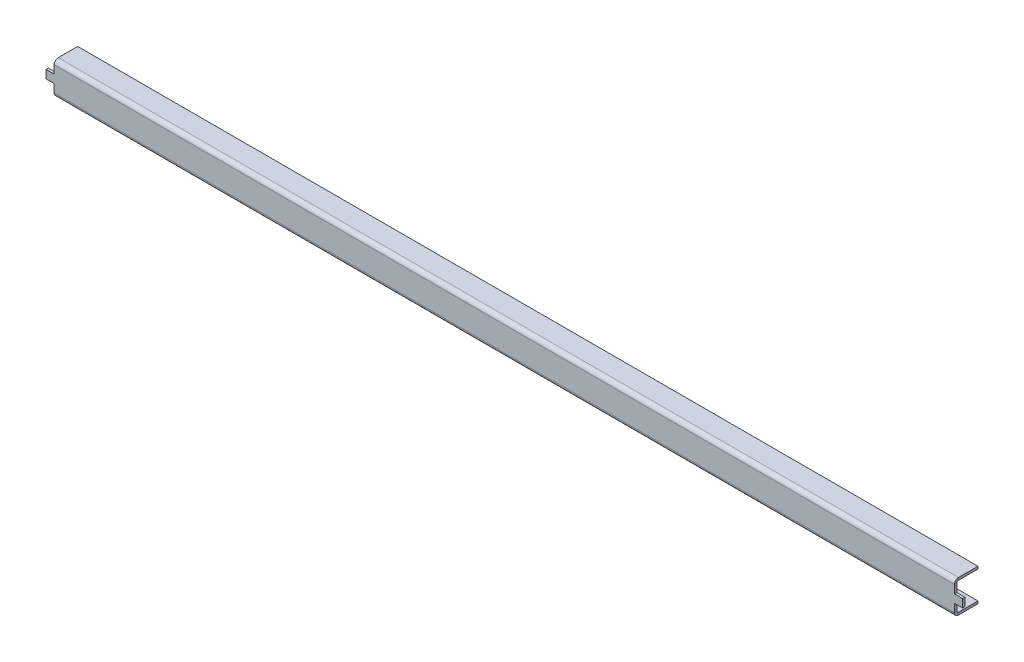
ISO-10303-21;
HEADER;
FILE_DESCRIPTION(('STEP AP214'),'2;1');
FILE_NAME('part.step','',(''),(''),'','','');
FILE_SCHEMA(('AUTOMOTIVE_DESIGN { 1 0 10303 214 1 1 1 1 }'));
ENDSEC;
DATA;
#1=APPLICATION_CONTEXT('core data for automotive mechanical design processes');
#2=APPLICATION_PROTOCOL_DEFINITION('international standard','automotive_design',2000,#1);
#3=PRODUCT_CONTEXT('',#1,'mechanical');
#4=PRODUCT('Part','Part','',(#3));
#5=PRODUCT_RELATED_PRODUCT_CATEGORY('part','',(#4));
#6=PRODUCT_DEFINITION_FORMATION('','',#4);
#7=PRODUCT_DEFINITION_CONTEXT('part definition',#1,'design');
#8=PRODUCT_DEFINITION('design','',#6,#7);
#9=PRODUCT_DEFINITION_SHAPE('','',#8);
#10=(LENGTH_UNIT() NAMED_UNIT(*) SI_UNIT(.MILLI.,.METRE.));
#11=(NAMED_UNIT(*) PLANE_ANGLE_UNIT() SI_UNIT($,.RADIAN.));
#12=(NAMED_UNIT(*) SI_UNIT($,.STERADIAN.) SOLID_ANGLE_UNIT());
#13=UNCERTAINTY_MEASURE_WITH_UNIT(LENGTH_MEASURE(1.E-05),#10,'distance_accuracy_value','');
#14=(GEOMETRIC_REPRESENTATION_CONTEXT(3) GLOBAL_UNCERTAINTY_ASSIGNED_CONTEXT((#13)) GLOBAL_UNIT_ASSIGNED_CONTEXT((#10,
#11,#12)) REPRESENTATION_CONTEXT('',''));
#15=CARTESIAN_POINT('',(0.,0.,0.));
#16=DIRECTION('',(0.,0.,1.));
#17=DIRECTION('',(1.,0.,0.));
#18=AXIS2_PLACEMENT_3D('',#15,#16,#17);
#19=CARTESIAN_POINT('',(277.5,-765.75989731651,4.21884749357559E-12));
#20=DIRECTION('',(0.,0.,1.));
#21=DIRECTION('',(0.,-1.,0.));
#22=AXIS2_PLACEMENT_3D('',#19,#20,#21);
#23=PLANE('',#22);
#24=DIRECTION('',(0.,1.,0.));
#25=VECTOR('',#24,1.);
#26=CARTESIAN_POINT('',(-277.5,-765.75989731651,4.21884749357559E-12));
#27=LINE('',#26,#25);
#28=CARTESIAN_POINT('',(-277.5,342.5,0.));
#29=VERTEX_POINT('',#28);
#30=CARTESIAN_POINT('',(-277.5,344.,0.));
#31=VERTEX_POINT('',#30);
#32=EDGE_CURVE('E292',#29,#31,#27,.T.);
#33=ORIENTED_EDGE('',*,*,#32,.T.);
#34=DIRECTION('',(1.,0.,0.));
#35=VECTOR('',#34,1.);
#36=CARTESIAN_POINT('',(277.5,344.,0.));
#37=LINE('',#36,#35);
#38=CARTESIAN_POINT('',(276.5,344.,0.));
#39=VERTEX_POINT('',#38);
#40=EDGE_CURVE('E280',#31,#39,#37,.T.);
#41=ORIENTED_EDGE('',*,*,#40,.T.);
#42=DIRECTION('',(0.,1.,0.));
#43=VECTOR('',#42,1.);
#44=CARTESIAN_POINT('',(276.5,-765.75989731651,4.16333634234434E-12));
#45=LINE('',#44,#43);
#46=CARTESIAN_POINT('',(276.5,342.5,-1.11022302462516E-13));
#47=VERTEX_POINT('',#46);
#48=EDGE_CURVE('E338',#47,#39,#45,.T.);
#49=ORIENTED_EDGE('',*,*,#48,.F.);
#50=DIRECTION('',(1.,0.,0.));
#51=VECTOR('',#50,1.);
#52=CARTESIAN_POINT('',(277.5,342.5,0.));
#53=LINE('',#52,#51);
#54=EDGE_CURVE('E65',#29,#47,#53,.T.);
#55=ORIENTED_EDGE('',*,*,#54,.F.);
#56=EDGE_LOOP('',(#33,#41,#49,#55));
#57=FACE_BOUND('',#56,.T.);
#58=ADVANCED_FACE('F53',(#57),#23,.F.);
#59=CARTESIAN_POINT('',(-277.5,-765.759897316509,12.0000000000043));
#60=DIRECTION('',(-1.,0.,0.));
#61=DIRECTION('',(0.,0.,1.));
#62=AXIS2_PLACEMENT_3D('',#59,#60,#61);
#63=PLANE('',#62);
#64=DIRECTION('',(0.,0.,1.));
#65=VECTOR('',#64,1.);
#66=CARTESIAN_POINT('',(-277.5,344.,12.0000000000001));
#67=LINE('',#66,#65);
#68=CARTESIAN_POINT('',(-277.5,344.,12.));
#69=VERTEX_POINT('',#68);
#70=EDGE_CURVE('E266',#69,#31,#67,.F.);
#71=ORIENTED_EDGE('',*,*,#70,.T.);
#72=ORIENTED_EDGE('',*,*,#32,.F.);
#73=DIRECTION('',(0.,0.,1.));
#74=VECTOR('',#73,1.);
#75=CARTESIAN_POINT('',(-277.5,342.5,12.0000000000001));
#76=LINE('',#75,#74);
#77=CARTESIAN_POINT('',(-277.5,342.5,12.0000000000001));
#78=VERTEX_POINT('',#77);
#79=EDGE_CURVE('E110',#29,#78,#76,.T.);
#80=ORIENTED_EDGE('',*,*,#79,.T.);
#81=DIRECTION('',(0.,1.,0.));
#82=VECTOR('',#81,1.);
#83=CARTESIAN_POINT('',(-277.5,-765.759897316509,12.0000000000043));
#84=LINE('',#83,#82);
#85=EDGE_CURVE('E263',#78,#69,#84,.T.);
#86=ORIENTED_EDGE('',*,*,#85,.T.);
#87=EDGE_LOOP('',(#71,#72,#80,#86));
#88=FACE_BOUND('',#87,.T.);
#89=ADVANCED_FACE('F265',(#88),#63,.T.);
#90=CARTESIAN_POINT('',(277.5,344.,0.));
#91=DIRECTION('',(0.,-1.,0.));
#92=DIRECTION('',(0.,0.,-1.));
#93=AXIS2_PLACEMENT_3D('',#90,#91,#92);
#94=PLANE('',#93);
#95=ORIENTED_EDGE('',*,*,#70,.F.);
#96=DIRECTION('',(-1.,0.,0.));
#97=VECTOR('',#96,1.);
#98=CARTESIAN_POINT('',(277.5,344.,12.));
#99=LINE('',#98,#97);
#100=CARTESIAN_POINT('',(276.5,344.,12.));
#101=VERTEX_POINT('',#100);
#102=EDGE_CURVE('E278',#101,#69,#99,.T.);
#103=ORIENTED_EDGE('',*,*,#102,.F.);
#104=DIRECTION('',(0.,0.,-1.));
#105=VECTOR('',#104,1.);
#106=CARTESIAN_POINT('',(276.5,344.,12.));
#107=LINE('',#106,#105);
#108=EDGE_CURVE('E272',#39,#101,#107,.F.);
#109=ORIENTED_EDGE('',*,*,#108,.F.);
#110=ORIENTED_EDGE('',*,*,#40,.F.);
#111=EDGE_LOOP('',(#95,#103,#109,#110));
#112=FACE_BOUND('',#111,.T.);
#113=ADVANCED_FACE('F277',(#112),#94,.F.);
#114=CARTESIAN_POINT('',(276.5,-765.75989731651,12.0000000000042));
#115=DIRECTION('',(1.,0.,0.));
#116=DIRECTION('',(0.,0.,-1.));
#117=AXIS2_PLACEMENT_3D('',#114,#115,#116);
#118=PLANE('',#117);
#119=ORIENTED_EDGE('',*,*,#108,.T.);
#120=DIRECTION('',(0.,1.,0.));
#121=VECTOR('',#120,1.);
#122=CARTESIAN_POINT('',(276.5,-765.75989731651,12.0000000000042));
#123=LINE('',#122,#121);
#124=CARTESIAN_POINT('',(276.5,342.5,12.));
#125=VERTEX_POINT('',#124);
#126=EDGE_CURVE('E58',#125,#101,#123,.T.);
#127=ORIENTED_EDGE('',*,*,#126,.F.);
#128=DIRECTION('',(0.,0.,-1.));
#129=VECTOR('',#128,1.);
#130=CARTESIAN_POINT('',(276.5,342.5,12.));
#131=LINE('',#130,#129);
#132=EDGE_CURVE('E77',#125,#47,#131,.T.);
#133=ORIENTED_EDGE('',*,*,#132,.T.);
#134=ORIENTED_EDGE('',*,*,#48,.T.);
#135=EDGE_LOOP('',(#119,#127,#133,#134));
#136=FACE_BOUND('',#135,.T.);
#137=ADVANCED_FACE('F493',(#136),#118,.T.);
#138=CARTESIAN_POINT('',(277.5,342.5,0.));
#139=DIRECTION('',(0.,-1.,0.));
#140=DIRECTION('',(0.,0.,-1.));
#141=AXIS2_PLACEMENT_3D('',#138,#139,#140);
#142=PLANE('',#141);
#143=ORIENTED_EDGE('',*,*,#79,.F.);
#144=ORIENTED_EDGE('',*,*,#54,.T.);
#145=ORIENTED_EDGE('',*,*,#132,.F.);
#146=DIRECTION('',(-1.,0.,0.));
#147=VECTOR('',#146,1.);
#148=CARTESIAN_POINT('',(277.5,342.5,12.));
#149=LINE('',#148,#147);
#150=EDGE_CURVE('E12',#125,#78,#149,.T.);
#151=ORIENTED_EDGE('',*,*,#150,.T.);
#152=EDGE_LOOP('',(#143,#144,#145,#151));
#153=FACE_BOUND('',#152,.T.);
#154=ADVANCED_FACE('F56',(#153),#142,.T.);
#155=CARTESIAN_POINT('',(277.5,1433.75989731651,4.21884749357559E-12));
#156=DIRECTION('',(0.,0.,1.));
#157=DIRECTION('',(0.,-1.,0.));
#158=AXIS2_PLACEMENT_3D('',#155,#156,#157);
#159=PLANE('',#158);
#160=DIRECTION('',(0.,-1.,0.));
#161=VECTOR('',#160,1.);
#162=CARTESIAN_POINT('',(276.5,1433.75989731651,4.16333634234434E-12));
#163=LINE('',#162,#161);
#164=CARTESIAN_POINT('',(276.5,325.5,-1.11022302462516E-13));
#165=VERTEX_POINT('',#164);
#166=CARTESIAN_POINT('',(276.5,324.,0.));
#167=VERTEX_POINT('',#166);
#168=EDGE_CURVE('E622',#165,#167,#163,.T.);
#169=ORIENTED_EDGE('',*,*,#168,.T.);
#170=DIRECTION('',(1.,0.,0.));
#171=VECTOR('',#170,1.);
#172=CARTESIAN_POINT('',(277.5,324.,0.));
#173=LINE('',#172,#171);
#174=CARTESIAN_POINT('',(-277.5,324.,0.));
#175=VERTEX_POINT('',#174);
#176=EDGE_CURVE('E121',#167,#175,#173,.F.);
#177=ORIENTED_EDGE('',*,*,#176,.T.);
#178=DIRECTION('',(0.,-1.,0.));
#179=VECTOR('',#178,1.);
#180=CARTESIAN_POINT('',(-277.5,1433.75989731651,4.21884749357559E-12));
#181=LINE('',#180,#179);
#182=CARTESIAN_POINT('',(-277.5,325.5,0.));
#183=VERTEX_POINT('',#182);
#184=EDGE_CURVE('E468',#183,#175,#181,.T.);
#185=ORIENTED_EDGE('',*,*,#184,.F.);
#186=DIRECTION('',(1.,0.,0.));
#187=VECTOR('',#186,1.);
#188=CARTESIAN_POINT('',(277.5,325.5,0.));
#189=LINE('',#188,#187);
#190=EDGE_CURVE('E461',#165,#183,#189,.F.);
#191=ORIENTED_EDGE('',*,*,#190,.F.);
#192=EDGE_LOOP('',(#169,#177,#185,#191));
#193=FACE_BOUND('',#192,.T.);
#194=ADVANCED_FACE('F598',(#193),#159,.F.);
#195=CARTESIAN_POINT('',(276.5,1433.75989731651,12.0000000000042));
#196=DIRECTION('',(1.,0.,0.));
#197=DIRECTION('',(0.,1.,0.));
#198=AXIS2_PLACEMENT_3D('',#195,#196,#197);
#199=PLANE('',#198);
#200=DIRECTION('',(0.,0.,-1.));
#201=VECTOR('',#200,1.);
#202=CARTESIAN_POINT('',(276.5,324.,12.0000000000001));
#203=LINE('',#202,#201);
#204=CARTESIAN_POINT('',(276.5,324.,11.9999999999999));
#205=VERTEX_POINT('',#204);
#206=EDGE_CURVE('E624',#205,#167,#203,.T.);
#207=ORIENTED_EDGE('',*,*,#206,.T.);
#208=ORIENTED_EDGE('',*,*,#168,.F.);
#209=DIRECTION('',(0.,0.,-1.));
#210=VECTOR('',#209,1.);
#211=CARTESIAN_POINT('',(276.5,325.5,12.));
#212=LINE('',#211,#210);
#213=CARTESIAN_POINT('',(276.5,325.5,12.));
#214=VERTEX_POINT('',#213);
#215=EDGE_CURVE('E154',#165,#214,#212,.F.);
#216=ORIENTED_EDGE('',*,*,#215,.T.);
#217=DIRECTION('',(0.,-1.,0.));
#218=VECTOR('',#217,1.);
#219=CARTESIAN_POINT('',(276.5,1433.75989731651,12.0000000000042));
#220=LINE('',#219,#218);
#221=EDGE_CURVE('E479',#214,#205,#220,.T.);
#222=ORIENTED_EDGE('',*,*,#221,.T.);
#223=EDGE_LOOP('',(#207,#208,#216,#222));
#224=FACE_BOUND('',#223,.T.);
#225=ADVANCED_FACE('F602',(#224),#199,.T.);
#226=CARTESIAN_POINT('',(277.5,324.,14.5000000000001));
#227=DIRECTION('',(0.,1.,0.));
#228=DIRECTION('',(0.,0.,1.));
#229=AXIS2_PLACEMENT_3D('',#226,#227,#228);
#230=PLANE('',#229);
#231=DIRECTION('',(0.,0.,1.));
#232=VECTOR('',#231,1.);
#233=CARTESIAN_POINT('',(-277.5,324.,12.));
#234=LINE('',#233,#232);
#235=CARTESIAN_POINT('',(-277.5,324.,12.0000000000001));
#236=VERTEX_POINT('',#235);
#237=EDGE_CURVE('E475',#175,#236,#234,.T.);
#238=ORIENTED_EDGE('',*,*,#237,.F.);
#239=ORIENTED_EDGE('',*,*,#176,.F.);
#240=ORIENTED_EDGE('',*,*,#206,.F.);
#241=DIRECTION('',(-1.,0.,0.));
#242=VECTOR('',#241,1.);
#243=CARTESIAN_POINT('',(277.5,324.,12.0000000000001));
#244=LINE('',#243,#242);
#245=EDGE_CURVE('E621',#236,#205,#244,.F.);
#246=ORIENTED_EDGE('',*,*,#245,.F.);
#247=EDGE_LOOP('',(#238,#239,#240,#246));
#248=FACE_BOUND('',#247,.T.);
#249=ADVANCED_FACE('F608',(#248),#230,.F.);
#250=CARTESIAN_POINT('',(-277.5,1433.75989731651,12.0000000000042));
#251=DIRECTION('',(-1.,0.,0.));
#252=DIRECTION('',(0.,-1.,0.));
#253=AXIS2_PLACEMENT_3D('',#250,#251,#252);
#254=PLANE('',#253);
#255=ORIENTED_EDGE('',*,*,#237,.T.);
#256=DIRECTION('',(0.,-1.,0.));
#257=VECTOR('',#256,1.);
#258=CARTESIAN_POINT('',(-277.5,1433.75989731651,12.0000000000043));
#259=LINE('',#258,#257);
#260=CARTESIAN_POINT('',(-277.5,325.5,12.0000000000001));
#261=VERTEX_POINT('',#260);
#262=EDGE_CURVE('E146',#261,#236,#259,.T.);
#263=ORIENTED_EDGE('',*,*,#262,.F.);
#264=DIRECTION('',(0.,0.,1.));
#265=VECTOR('',#264,1.);
#266=CARTESIAN_POINT('',(-277.5,325.5,12.));
#267=LINE('',#266,#265);
#268=EDGE_CURVE('E472',#261,#183,#267,.F.);
#269=ORIENTED_EDGE('',*,*,#268,.T.);
#270=ORIENTED_EDGE('',*,*,#184,.T.);
#271=EDGE_LOOP('',(#255,#263,#269,#270));
#272=FACE_BOUND('',#271,.T.);
#273=ADVANCED_FACE('F577',(#272),#254,.T.);
#274=CARTESIAN_POINT('',(277.5,325.5,14.5000000000001));
#275=DIRECTION('',(0.,1.,0.));
#276=DIRECTION('',(0.,0.,1.));
#277=AXIS2_PLACEMENT_3D('',#274,#275,#276);
#278=PLANE('',#277);
#279=ORIENTED_EDGE('',*,*,#268,.F.);
#280=DIRECTION('',(-1.,0.,0.));
#281=VECTOR('',#280,1.);
#282=CARTESIAN_POINT('',(277.5,325.5,12.0000000000001));
#283=LINE('',#282,#281);
#284=EDGE_CURVE('E465',#261,#214,#283,.F.);
#285=ORIENTED_EDGE('',*,*,#284,.T.);
#286=ORIENTED_EDGE('',*,*,#215,.F.);
#287=ORIENTED_EDGE('',*,*,#190,.T.);
#288=EDGE_LOOP('',(#279,#285,#286,#287));
#289=FACE_BOUND('',#288,.T.);
#290=ADVANCED_FACE('F570',(#289),#278,.T.);
#291=CARTESIAN_POINT('',(277.5,344.,14.5));
#292=DIRECTION('',(0.,0.,-1.));
#293=DIRECTION('',(0.,1.,0.));
#294=AXIS2_PLACEMENT_3D('',#291,#292,#293);
#295=PLANE('',#294);
#296=DIRECTION('',(0.,1.,0.));
#297=VECTOR('',#296,1.);
#298=CARTESIAN_POINT('',(-277.5,342.5,14.5));
#299=LINE('',#298,#297);
#300=CARTESIAN_POINT('',(-277.5,326.5,14.5));
#301=VERTEX_POINT('',#300);
#302=CARTESIAN_POINT('',(-277.5,331.5,14.5000000000003));
#303=VERTEX_POINT('',#302);
#304=EDGE_CURVE('E344',#301,#303,#299,.T.);
#305=ORIENTED_EDGE('',*,*,#304,.F.);
#306=DIRECTION('',(1.,0.,0.));
#307=VECTOR('',#306,1.);
#308=CARTESIAN_POINT('',(277.5,326.5,14.5));
#309=LINE('',#308,#307);
#310=CARTESIAN_POINT('',(276.5,326.5,14.5));
#311=VERTEX_POINT('',#310);
#312=EDGE_CURVE('E350',#311,#301,#309,.F.);
#313=ORIENTED_EDGE('',*,*,#312,.F.);
#314=DIRECTION('',(0.,1.,0.));
#315=VECTOR('',#314,1.);
#316=CARTESIAN_POINT('',(276.5,325.5,14.5));
#317=LINE('',#316,#315);
#318=CARTESIAN_POINT('',(276.5,331.5,14.5));
#319=VERTEX_POINT('',#318);
#320=EDGE_CURVE('E543',#319,#311,#317,.F.);
#321=ORIENTED_EDGE('',*,*,#320,.F.);
#322=DIRECTION('',(1.,0.,0.));
#323=VECTOR('',#322,1.);
#324=CARTESIAN_POINT('',(276.5,331.5,14.5000000000003));
#325=LINE('',#324,#323);
#326=CARTESIAN_POINT('',(281.5,331.5,14.5000000000003));
#327=VERTEX_POINT('',#326);
#328=EDGE_CURVE('E548',#319,#327,#325,.T.);
#329=ORIENTED_EDGE('',*,*,#328,.T.);
#330=DIRECTION('',(0.,1.,0.));
#331=VECTOR('',#330,1.);
#332=CARTESIAN_POINT('',(281.5,331.5,14.5000000000003));
#333=LINE('',#332,#331);
#334=CARTESIAN_POINT('',(281.5,336.5,14.5000000000003));
#335=VERTEX_POINT('',#334);
#336=EDGE_CURVE('E545',#327,#335,#333,.T.);
#337=ORIENTED_EDGE('',*,*,#336,.T.);
#338=DIRECTION('',(-1.,0.,0.));
#339=VECTOR('',#338,1.);
#340=CARTESIAN_POINT('',(276.5,336.5,14.5000000000003));
#341=LINE('',#340,#339);
#342=CARTESIAN_POINT('',(276.5,336.5,14.5000000000003));
#343=VERTEX_POINT('',#342);
#344=EDGE_CURVE('E542',#335,#343,#341,.T.);
#345=ORIENTED_EDGE('',*,*,#344,.T.);
#346=CARTESIAN_POINT('',(276.5,341.5,14.5));
#347=VERTEX_POINT('',#346);
#348=EDGE_CURVE('E508',#347,#343,#317,.F.);
#349=ORIENTED_EDGE('',*,*,#348,.F.);
#350=DIRECTION('',(-1.,0.,0.));
#351=VECTOR('',#350,1.);
#352=CARTESIAN_POINT('',(277.5,341.5,14.5));
#353=LINE('',#352,#351);
#354=CARTESIAN_POINT('',(-277.5,341.5,14.5));
#355=VERTEX_POINT('',#354);
#356=EDGE_CURVE('E369',#355,#347,#353,.F.);
#357=ORIENTED_EDGE('',*,*,#356,.F.);
#358=CARTESIAN_POINT('',(-277.5,336.5,14.5));
#359=VERTEX_POINT('',#358);
#360=EDGE_CURVE('E352',#359,#355,#299,.T.);
#361=ORIENTED_EDGE('',*,*,#360,.F.);
#362=DIRECTION('',(-1.,0.,0.));
#363=VECTOR('',#362,1.);
#364=CARTESIAN_POINT('',(-277.5,336.5,14.5000000000003));
#365=LINE('',#364,#363);
#366=CARTESIAN_POINT('',(-282.5,336.5,14.5000000000003));
#367=VERTEX_POINT('',#366);
#368=EDGE_CURVE('E364',#359,#367,#365,.T.);
#369=ORIENTED_EDGE('',*,*,#368,.T.);
#370=DIRECTION('',(0.,-1.,0.));
#371=VECTOR('',#370,1.);
#372=CARTESIAN_POINT('',(-282.5,336.5,14.5000000000003));
#373=LINE('',#372,#371);
#374=CARTESIAN_POINT('',(-282.5,331.5,14.5000000000003));
#375=VERTEX_POINT('',#374);
#376=EDGE_CURVE('E368',#367,#375,#373,.T.);
#377=ORIENTED_EDGE('',*,*,#376,.T.);
#378=DIRECTION('',(1.,0.,0.));
#379=VECTOR('',#378,1.);
#380=CARTESIAN_POINT('',(-277.5,331.5,14.5000000000003));
#381=LINE('',#380,#379);
#382=EDGE_CURVE('E373',#375,#303,#381,.T.);
#383=ORIENTED_EDGE('',*,*,#382,.T.);
#384=EDGE_LOOP('',(#305,#313,#321,#329,#337,#345,#349,#357,#361,#369,#377,#383));
#385=FACE_BOUND('',#384,.T.);
#386=ADVANCED_FACE('F568',(#385),#295,.F.);
#387=CARTESIAN_POINT('',(-277.5,343.999999999999,-1115.39886564991));
#388=DIRECTION('',(1.,0.,0.));
#389=DIRECTION('',(0.,0.,-1.));
#390=AXIS2_PLACEMENT_3D('',#387,#388,#389);
#391=PLANE('',#390);
#392=DIRECTION('',(0.,0.,1.));
#393=VECTOR('',#392,1.);
#394=CARTESIAN_POINT('',(-277.5,326.499999999999,-1115.39886564991));
#395=LINE('',#394,#393);
#396=CARTESIAN_POINT('',(-277.5,326.5,13.));
#397=VERTEX_POINT('',#396);
#398=EDGE_CURVE('E418',#397,#301,#395,.T.);
#399=ORIENTED_EDGE('',*,*,#398,.T.);
#400=ORIENTED_EDGE('',*,*,#304,.T.);
#401=DIRECTION('',(0.,0.,1.));
#402=VECTOR('',#401,1.);
#403=CARTESIAN_POINT('',(-277.5,331.499999999999,-1115.39886564991));
#404=LINE('',#403,#402);
#405=CARTESIAN_POINT('',(-277.5,331.5,13.0000000000001));
#406=VERTEX_POINT('',#405);
#407=EDGE_CURVE('E458',#406,#303,#404,.T.);
#408=ORIENTED_EDGE('',*,*,#407,.F.);
#409=DIRECTION('',(0.,1.,0.));
#410=VECTOR('',#409,1.);
#411=CARTESIAN_POINT('',(-277.5,344.,13.));
#412=LINE('',#411,#410);
#413=EDGE_CURVE('E377',#397,#406,#412,.T.);
#414=ORIENTED_EDGE('',*,*,#413,.F.);
#415=EDGE_LOOP('',(#399,#400,#408,#414));
#416=FACE_BOUND('',#415,.T.);
#417=ADVANCED_FACE('F525',(#416),#391,.F.);
#418=CARTESIAN_POINT('',(-277.5,331.499999999999,-1115.39886564991));
#419=DIRECTION('',(0.,-1.,0.));
#420=DIRECTION('',(0.,0.,-1.));
#421=AXIS2_PLACEMENT_3D('',#418,#419,#420);
#422=PLANE('',#421);
#423=ORIENTED_EDGE('',*,*,#382,.F.);
#424=DIRECTION('',(0.,0.,1.));
#425=VECTOR('',#424,1.);
#426=CARTESIAN_POINT('',(-282.5,331.499999999999,-1115.39886564991));
#427=LINE('',#426,#425);
#428=CARTESIAN_POINT('',(-282.5,331.5,13.0000000000001));
#429=VERTEX_POINT('',#428);
#430=EDGE_CURVE('E455',#429,#375,#427,.T.);
#431=ORIENTED_EDGE('',*,*,#430,.F.);
#432=DIRECTION('',(1.,0.,0.));
#433=VECTOR('',#432,1.);
#434=CARTESIAN_POINT('',(-277.5,331.5,13.0000000000003));
#435=LINE('',#434,#433);
#436=EDGE_CURVE('E162',#429,#406,#435,.T.);
#437=ORIENTED_EDGE('',*,*,#436,.T.);
#438=ORIENTED_EDGE('',*,*,#407,.T.);
#439=EDGE_LOOP('',(#423,#431,#437,#438));
#440=FACE_BOUND('',#439,.T.);
#441=ADVANCED_FACE('F528',(#440),#422,.T.);
#442=CARTESIAN_POINT('',(-282.5,336.499999999999,-1115.39886564991));
#443=DIRECTION('',(-1.,0.,0.));
#444=DIRECTION('',(0.,0.,1.));
#445=AXIS2_PLACEMENT_3D('',#442,#443,#444);
#446=PLANE('',#445);
#447=ORIENTED_EDGE('',*,*,#376,.F.);
#448=DIRECTION('',(0.,0.,1.));
#449=VECTOR('',#448,1.);
#450=CARTESIAN_POINT('',(-282.5,336.499999999999,-1115.39886564991));
#451=LINE('',#450,#449);
#452=CARTESIAN_POINT('',(-282.5,336.5,13.0000000000001));
#453=VERTEX_POINT('',#452);
#454=EDGE_CURVE('E451',#453,#367,#451,.T.);
#455=ORIENTED_EDGE('',*,*,#454,.F.);
#456=DIRECTION('',(0.,-1.,0.));
#457=VECTOR('',#456,1.);
#458=CARTESIAN_POINT('',(-282.5,336.5,13.0000000000003));
#459=LINE('',#458,#457);
#460=EDGE_CURVE('E170',#453,#429,#459,.T.);
#461=ORIENTED_EDGE('',*,*,#460,.T.);
#462=ORIENTED_EDGE('',*,*,#430,.T.);
#463=EDGE_LOOP('',(#447,#455,#461,#462));
#464=FACE_BOUND('',#463,.T.);
#465=ADVANCED_FACE('F531',(#464),#446,.T.);
#466=CARTESIAN_POINT('',(-277.5,336.499999999999,-1115.39886564991));
#467=DIRECTION('',(0.,1.,0.));
#468=DIRECTION('',(0.,0.,1.));
#469=AXIS2_PLACEMENT_3D('',#466,#467,#468);
#470=PLANE('',#469);
#471=ORIENTED_EDGE('',*,*,#368,.F.);
#472=DIRECTION('',(0.,0.,1.));
#473=VECTOR('',#472,1.);
#474=CARTESIAN_POINT('',(-277.5,336.499999999999,-1115.39886564991));
#475=LINE('',#474,#473);
#476=CARTESIAN_POINT('',(-277.5,336.5,13.0000000000001));
#477=VERTEX_POINT('',#476);
#478=EDGE_CURVE('E447',#477,#359,#475,.T.);
#479=ORIENTED_EDGE('',*,*,#478,.F.);
#480=DIRECTION('',(-1.,0.,0.));
#481=VECTOR('',#480,1.);
#482=CARTESIAN_POINT('',(-277.5,336.5,13.0000000000003));
#483=LINE('',#482,#481);
#484=EDGE_CURVE('E390',#477,#453,#483,.T.);
#485=ORIENTED_EDGE('',*,*,#484,.T.);
#486=ORIENTED_EDGE('',*,*,#454,.T.);
#487=EDGE_LOOP('',(#471,#479,#485,#486));
#488=FACE_BOUND('',#487,.T.);
#489=ADVANCED_FACE('F534',(#488),#470,.T.);
#490=ORIENTED_EDGE('',*,*,#478,.T.);
#491=ORIENTED_EDGE('',*,*,#360,.T.);
#492=DIRECTION('',(0.,0.,1.));
#493=VECTOR('',#492,1.);
#494=CARTESIAN_POINT('',(-277.5,341.499999999999,-1115.39886564991));
#495=LINE('',#494,#493);
#496=CARTESIAN_POINT('',(-277.5,341.5,13.));
#497=VERTEX_POINT('',#496);
#498=EDGE_CURVE('E295',#497,#355,#495,.T.);
#499=ORIENTED_EDGE('',*,*,#498,.F.);
#500=EDGE_CURVE('E394',#477,#497,#412,.T.);
#501=ORIENTED_EDGE('',*,*,#500,.F.);
#502=EDGE_LOOP('',(#490,#491,#499,#501));
#503=FACE_BOUND('',#502,.T.);
#504=ADVANCED_FACE('F538',(#503),#391,.F.);
#505=CARTESIAN_POINT('',(276.5,343.999999999999,-1115.39886564991));
#506=DIRECTION('',(-1.,0.,0.));
#507=DIRECTION('',(0.,0.,1.));
#508=AXIS2_PLACEMENT_3D('',#505,#506,#507);
#509=PLANE('',#508);
#510=DIRECTION('',(0.,0.,1.));
#511=VECTOR('',#510,1.);
#512=CARTESIAN_POINT('',(276.5,341.499999999999,-1115.39886564991));
#513=LINE('',#512,#511);
#514=CARTESIAN_POINT('',(276.5,341.5,13.));
#515=VERTEX_POINT('',#514);
#516=EDGE_CURVE('E441',#515,#347,#513,.T.);
#517=ORIENTED_EDGE('',*,*,#516,.T.);
#518=ORIENTED_EDGE('',*,*,#348,.T.);
#519=DIRECTION('',(0.,0.,1.));
#520=VECTOR('',#519,1.);
#521=CARTESIAN_POINT('',(276.5,336.499999999999,-1115.39886564991));
#522=LINE('',#521,#520);
#523=CARTESIAN_POINT('',(276.5,336.5,13.0000000000001));
#524=VERTEX_POINT('',#523);
#525=EDGE_CURVE('E437',#524,#343,#522,.T.);
#526=ORIENTED_EDGE('',*,*,#525,.F.);
#527=DIRECTION('',(0.,1.,0.));
#528=VECTOR('',#527,1.);
#529=CARTESIAN_POINT('',(276.5,344.,13.));
#530=LINE('',#529,#528);
#531=EDGE_CURVE('E406',#515,#524,#530,.F.);
#532=ORIENTED_EDGE('',*,*,#531,.F.);
#533=EDGE_LOOP('',(#517,#518,#526,#532));
#534=FACE_BOUND('',#533,.T.);
#535=ADVANCED_FACE('F506',(#534),#509,.F.);
#536=CARTESIAN_POINT('',(276.5,336.499999999999,-1115.39886564991));
#537=DIRECTION('',(0.,1.,0.));
#538=DIRECTION('',(0.,0.,1.));
#539=AXIS2_PLACEMENT_3D('',#536,#537,#538);
#540=PLANE('',#539);
#541=ORIENTED_EDGE('',*,*,#344,.F.);
#542=DIRECTION('',(0.,0.,1.));
#543=VECTOR('',#542,1.);
#544=CARTESIAN_POINT('',(281.5,336.499999999999,-1115.39886564991));
#545=LINE('',#544,#543);
#546=CARTESIAN_POINT('',(281.5,336.5,13.0000000000001));
#547=VERTEX_POINT('',#546);
#548=EDGE_CURVE('E433',#547,#335,#545,.T.);
#549=ORIENTED_EDGE('',*,*,#548,.F.);
#550=DIRECTION('',(-1.,0.,0.));
#551=VECTOR('',#550,1.);
#552=CARTESIAN_POINT('',(276.5,336.5,13.0000000000003));
#553=LINE('',#552,#551);
#554=EDGE_CURVE('E402',#547,#524,#553,.T.);
#555=ORIENTED_EDGE('',*,*,#554,.T.);
#556=ORIENTED_EDGE('',*,*,#525,.T.);
#557=EDGE_LOOP('',(#541,#549,#555,#556));
#558=FACE_BOUND('',#557,.T.);
#559=ADVANCED_FACE('F652',(#558),#540,.T.);
#560=CARTESIAN_POINT('',(281.5,331.499999999999,-1115.39886564991));
#561=DIRECTION('',(1.,0.,0.));
#562=DIRECTION('',(0.,0.,-1.));
#563=AXIS2_PLACEMENT_3D('',#560,#561,#562);
#564=PLANE('',#563);
#565=ORIENTED_EDGE('',*,*,#336,.F.);
#566=DIRECTION('',(0.,0.,1.));
#567=VECTOR('',#566,1.);
#568=CARTESIAN_POINT('',(281.5,331.499999999999,-1115.39886564991));
#569=LINE('',#568,#567);
#570=CARTESIAN_POINT('',(281.5,331.5,13.0000000000001));
#571=VERTEX_POINT('',#570);
#572=EDGE_CURVE('E429',#571,#327,#569,.T.);
#573=ORIENTED_EDGE('',*,*,#572,.F.);
#574=DIRECTION('',(0.,1.,0.));
#575=VECTOR('',#574,1.);
#576=CARTESIAN_POINT('',(281.5,331.5,13.0000000000003));
#577=LINE('',#576,#575);
#578=EDGE_CURVE('E405',#571,#547,#577,.T.);
#579=ORIENTED_EDGE('',*,*,#578,.T.);
#580=ORIENTED_EDGE('',*,*,#548,.T.);
#581=EDGE_LOOP('',(#565,#573,#579,#580));
#582=FACE_BOUND('',#581,.T.);
#583=ADVANCED_FACE('F644',(#582),#564,.T.);
#584=CARTESIAN_POINT('',(276.5,331.499999999999,-1115.39886564991));
#585=DIRECTION('',(0.,-1.,0.));
#586=DIRECTION('',(0.,0.,-1.));
#587=AXIS2_PLACEMENT_3D('',#584,#585,#586);
#588=PLANE('',#587);
#589=ORIENTED_EDGE('',*,*,#328,.F.);
#590=DIRECTION('',(0.,0.,1.));
#591=VECTOR('',#590,1.);
#592=CARTESIAN_POINT('',(276.5,331.499999999999,-1115.39886564991));
#593=LINE('',#592,#591);
#594=CARTESIAN_POINT('',(276.5,331.5,13.0000000000001));
#595=VERTEX_POINT('',#594);
#596=EDGE_CURVE('E425',#595,#319,#593,.T.);
#597=ORIENTED_EDGE('',*,*,#596,.F.);
#598=DIRECTION('',(1.,0.,0.));
#599=VECTOR('',#598,1.);
#600=CARTESIAN_POINT('',(276.5,331.5,13.0000000000003));
#601=LINE('',#600,#599);
#602=EDGE_CURVE('E409',#595,#571,#601,.T.);
#603=ORIENTED_EDGE('',*,*,#602,.T.);
#604=ORIENTED_EDGE('',*,*,#572,.T.);
#605=EDGE_LOOP('',(#589,#597,#603,#604));
#606=FACE_BOUND('',#605,.T.);
#607=ADVANCED_FACE('F639',(#606),#588,.T.);
#608=ORIENTED_EDGE('',*,*,#596,.T.);
#609=ORIENTED_EDGE('',*,*,#320,.T.);
#610=DIRECTION('',(0.,0.,1.));
#611=VECTOR('',#610,1.);
#612=CARTESIAN_POINT('',(276.5,326.499999999999,-1115.39886564991));
#613=LINE('',#612,#611);
#614=CARTESIAN_POINT('',(276.5,326.5,13.));
#615=VERTEX_POINT('',#614);
#616=EDGE_CURVE('E422',#615,#311,#613,.T.);
#617=ORIENTED_EDGE('',*,*,#616,.F.);
#618=EDGE_CURVE('E413',#595,#615,#530,.F.);
#619=ORIENTED_EDGE('',*,*,#618,.F.);
#620=EDGE_LOOP('',(#608,#609,#617,#619));
#621=FACE_BOUND('',#620,.T.);
#622=ADVANCED_FACE('F636',(#621),#509,.F.);
#623=CARTESIAN_POINT('',(277.5,344.,13.));
#624=DIRECTION('',(0.,0.,-1.));
#625=DIRECTION('',(0.,1.,0.));
#626=AXIS2_PLACEMENT_3D('',#623,#624,#625);
#627=PLANE('',#626);
#628=ORIENTED_EDGE('',*,*,#413,.T.);
#629=ORIENTED_EDGE('',*,*,#436,.F.);
#630=ORIENTED_EDGE('',*,*,#460,.F.);
#631=ORIENTED_EDGE('',*,*,#484,.F.);
#632=ORIENTED_EDGE('',*,*,#500,.T.);
#633=DIRECTION('',(1.,0.,0.));
#634=VECTOR('',#633,1.);
#635=CARTESIAN_POINT('',(277.5,341.5,13.));
#636=LINE('',#635,#634);
#637=EDGE_CURVE('E395',#497,#515,#636,.T.);
#638=ORIENTED_EDGE('',*,*,#637,.T.);
#639=ORIENTED_EDGE('',*,*,#531,.T.);
#640=ORIENTED_EDGE('',*,*,#554,.F.);
#641=ORIENTED_EDGE('',*,*,#578,.F.);
#642=ORIENTED_EDGE('',*,*,#602,.F.);
#643=ORIENTED_EDGE('',*,*,#618,.T.);
#644=DIRECTION('',(1.,0.,0.));
#645=VECTOR('',#644,1.);
#646=CARTESIAN_POINT('',(277.5,326.5,13.));
#647=LINE('',#646,#645);
#648=EDGE_CURVE('E414',#615,#397,#647,.F.);
#649=ORIENTED_EDGE('',*,*,#648,.T.);
#650=EDGE_LOOP('',(#628,#629,#630,#631,#632,#638,#639,#640,#641,#642,#643,#649));
#651=FACE_BOUND('',#650,.T.);
#652=ADVANCED_FACE('F516',(#651),#627,.T.);
#653=CARTESIAN_POINT('',(-277.5,326.5,12.));
#654=DIRECTION('',(-1.,0.,0.));
#655=DIRECTION('',(0.,-1.,0.));
#656=AXIS2_PLACEMENT_3D('',#653,#654,#655);
#657=PLANE('',#656);
#658=ORIENTED_EDGE('',*,*,#398,.F.);
#659=CARTESIAN_POINT('',(-277.5,326.5,12.));
#660=DIRECTION('',(-1.,0.,0.));
#661=DIRECTION('',(0.,0.,1.));
#662=AXIS2_PLACEMENT_3D('',#659,#660,#661);
#663=CIRCLE('',#662,0.999999999999964);
#664=EDGE_CURVE('E353',#397,#261,#663,.F.);
#665=ORIENTED_EDGE('',*,*,#664,.T.);
#666=ORIENTED_EDGE('',*,*,#262,.T.);
#667=CARTESIAN_POINT('',(-277.5,326.5,12.));
#668=DIRECTION('',(-1.,0.,0.));
#669=DIRECTION('',(0.,0.,1.));
#670=AXIS2_PLACEMENT_3D('',#667,#668,#669);
#671=CIRCLE('',#670,2.49999999999996);
#672=EDGE_CURVE('E351',#301,#236,#671,.F.);
#673=ORIENTED_EDGE('',*,*,#672,.F.);
#674=EDGE_LOOP('',(#658,#665,#666,#673));
#675=FACE_BOUND('',#674,.T.);
#676=ADVANCED_FACE('F563',(#675),#657,.T.);
#677=CARTESIAN_POINT('',(276.5,326.5,12.0000000000001));
#678=DIRECTION('',(1.,0.,0.));
#679=DIRECTION('',(0.,1.,0.));
#680=AXIS2_PLACEMENT_3D('',#677,#678,#679);
#681=PLANE('',#680);
#682=ORIENTED_EDGE('',*,*,#221,.F.);
#683=CARTESIAN_POINT('',(276.5,326.5,12.0000000000001));
#684=DIRECTION('',(-1.,0.,0.));
#685=DIRECTION('',(0.,0.,1.));
#686=AXIS2_PLACEMENT_3D('',#683,#684,#685);
#687=CIRCLE('',#686,0.999999999999964);
#688=EDGE_CURVE('E301',#214,#615,#687,.T.);
#689=ORIENTED_EDGE('',*,*,#688,.T.);
#690=ORIENTED_EDGE('',*,*,#616,.T.);
#691=CARTESIAN_POINT('',(276.5,326.5,12.0000000000001));
#692=DIRECTION('',(-1.,0.,0.));
#693=DIRECTION('',(0.,0.,1.));
#694=AXIS2_PLACEMENT_3D('',#691,#692,#693);
#695=CIRCLE('',#694,2.49999999999996);
#696=EDGE_CURVE('E561',#205,#311,#695,.T.);
#697=ORIENTED_EDGE('',*,*,#696,.F.);
#698=EDGE_LOOP('',(#682,#689,#690,#697));
#699=FACE_BOUND('',#698,.T.);
#700=ADVANCED_FACE('F831',(#699),#681,.T.);
#701=CARTESIAN_POINT('',(842.215697148312,326.5,12.0000000000001));
#702=DIRECTION('',(-1.,0.,0.));
#703=DIRECTION('',(0.,0.,1.));
#704=AXIS2_PLACEMENT_3D('',#701,#702,#703);
#705=CYLINDRICAL_SURFACE('',#704,2.49999999999996);
#706=ORIENTED_EDGE('',*,*,#696,.T.);
#707=ORIENTED_EDGE('',*,*,#312,.T.);
#708=ORIENTED_EDGE('',*,*,#672,.T.);
#709=ORIENTED_EDGE('',*,*,#245,.T.);
#710=EDGE_LOOP('',(#706,#707,#708,#709));
#711=FACE_BOUND('',#710,.T.);
#712=ADVANCED_FACE('F558',(#711),#705,.T.);
#713=CARTESIAN_POINT('',(842.215697148312,326.5,12.0000000000001));
#714=DIRECTION('',(-1.,0.,0.));
#715=DIRECTION('',(0.,0.,1.));
#716=AXIS2_PLACEMENT_3D('',#713,#714,#715);
#717=CYLINDRICAL_SURFACE('',#716,0.999999999999964);
#718=ORIENTED_EDGE('',*,*,#688,.F.);
#719=ORIENTED_EDGE('',*,*,#284,.F.);
#720=ORIENTED_EDGE('',*,*,#664,.F.);
#721=ORIENTED_EDGE('',*,*,#648,.F.);
#722=EDGE_LOOP('',(#718,#719,#720,#721));
#723=FACE_BOUND('',#722,.T.);
#724=ADVANCED_FACE('F848',(#723),#717,.F.);
#725=CARTESIAN_POINT('',(276.5,341.5,12.));
#726=DIRECTION('',(1.,0.,0.));
#727=DIRECTION('',(0.,1.,0.));
#728=AXIS2_PLACEMENT_3D('',#725,#726,#727);
#729=PLANE('',#728);
#730=ORIENTED_EDGE('',*,*,#516,.F.);
#731=CARTESIAN_POINT('',(276.5,341.5,12.));
#732=DIRECTION('',(1.,0.,0.));
#733=DIRECTION('',(0.,1.,0.));
#734=AXIS2_PLACEMENT_3D('',#731,#732,#733);
#735=CIRCLE('',#734,0.999999999999956);
#736=EDGE_CURVE('E297',#515,#125,#735,.F.);
#737=ORIENTED_EDGE('',*,*,#736,.T.);
#738=ORIENTED_EDGE('',*,*,#126,.T.);
#739=CARTESIAN_POINT('',(276.5,341.5,12.));
#740=DIRECTION('',(1.,0.,0.));
#741=DIRECTION('',(0.,1.,0.));
#742=AXIS2_PLACEMENT_3D('',#739,#740,#741);
#743=CIRCLE('',#742,2.49999999999996);
#744=EDGE_CURVE('E290',#347,#101,#743,.F.);
#745=ORIENTED_EDGE('',*,*,#744,.F.);
#746=EDGE_LOOP('',(#730,#737,#738,#745));
#747=FACE_BOUND('',#746,.T.);
#748=ADVANCED_FACE('F502',(#747),#729,.T.);
#749=CARTESIAN_POINT('',(-277.5,341.5,12.0000000000001));
#750=DIRECTION('',(-1.,0.,0.));
#751=DIRECTION('',(0.,-1.,0.));
#752=AXIS2_PLACEMENT_3D('',#749,#750,#751);
#753=PLANE('',#752);
#754=ORIENTED_EDGE('',*,*,#85,.F.);
#755=CARTESIAN_POINT('',(-277.5,341.5,12.0000000000001));
#756=DIRECTION('',(1.,0.,0.));
#757=DIRECTION('',(0.,1.,0.));
#758=AXIS2_PLACEMENT_3D('',#755,#756,#757);
#759=CIRCLE('',#758,0.999999999999956);
#760=EDGE_CURVE('E304',#78,#497,#759,.T.);
#761=ORIENTED_EDGE('',*,*,#760,.T.);
#762=ORIENTED_EDGE('',*,*,#498,.T.);
#763=CARTESIAN_POINT('',(-277.5,341.5,12.0000000000001));
#764=DIRECTION('',(1.,0.,0.));
#765=DIRECTION('',(0.,1.,0.));
#766=AXIS2_PLACEMENT_3D('',#763,#764,#765);
#767=CIRCLE('',#766,2.49999999999996);
#768=EDGE_CURVE('E287',#69,#355,#767,.T.);
#769=ORIENTED_EDGE('',*,*,#768,.F.);
#770=EDGE_LOOP('',(#754,#761,#762,#769));
#771=FACE_BOUND('',#770,.T.);
#772=ADVANCED_FACE('F293',(#771),#753,.T.);
#773=CARTESIAN_POINT('',(-842.593133916879,341.5,12.0000000000001));
#774=DIRECTION('',(1.,0.,0.));
#775=DIRECTION('',(0.,1.,0.));
#776=AXIS2_PLACEMENT_3D('',#773,#774,#775);
#777=CYLINDRICAL_SURFACE('',#776,2.49999999999996);
#778=ORIENTED_EDGE('',*,*,#768,.T.);
#779=ORIENTED_EDGE('',*,*,#356,.T.);
#780=ORIENTED_EDGE('',*,*,#744,.T.);
#781=ORIENTED_EDGE('',*,*,#102,.T.);
#782=EDGE_LOOP('',(#778,#779,#780,#781));
#783=FACE_BOUND('',#782,.T.);
#784=ADVANCED_FACE('F286',(#783),#777,.T.);
#785=CARTESIAN_POINT('',(-842.593133916879,341.5,12.0000000000001));
#786=DIRECTION('',(1.,0.,0.));
#787=DIRECTION('',(0.,1.,0.));
#788=AXIS2_PLACEMENT_3D('',#785,#786,#787);
#789=CYLINDRICAL_SURFACE('',#788,0.999999999999956);
#790=ORIENTED_EDGE('',*,*,#760,.F.);
#791=ORIENTED_EDGE('',*,*,#150,.F.);
#792=ORIENTED_EDGE('',*,*,#736,.F.);
#793=ORIENTED_EDGE('',*,*,#637,.F.);
#794=EDGE_LOOP('',(#790,#791,#792,#793));
#795=FACE_BOUND('',#794,.T.);
#796=ADVANCED_FACE('F498',(#795),#789,.F.);
#797=CLOSED_SHELL('',(#58,#89,#113,#137,#154,#194,#225,#249,#273,#290,#386,#417,#441,#465,#489,
#504,#535,#559,#583,#607,#622,#652,#676,#700,#712,#724,#748,#772,#784,#796));
#798=MANIFOLD_SOLID_BREP('B2',#797);
#799=ADVANCED_BREP_SHAPE_REPRESENTATION('',(#18,#798),#14);
#800=SHAPE_DEFINITION_REPRESENTATION(#9,#799);
ENDSEC;
END-ISO-10303-21;
